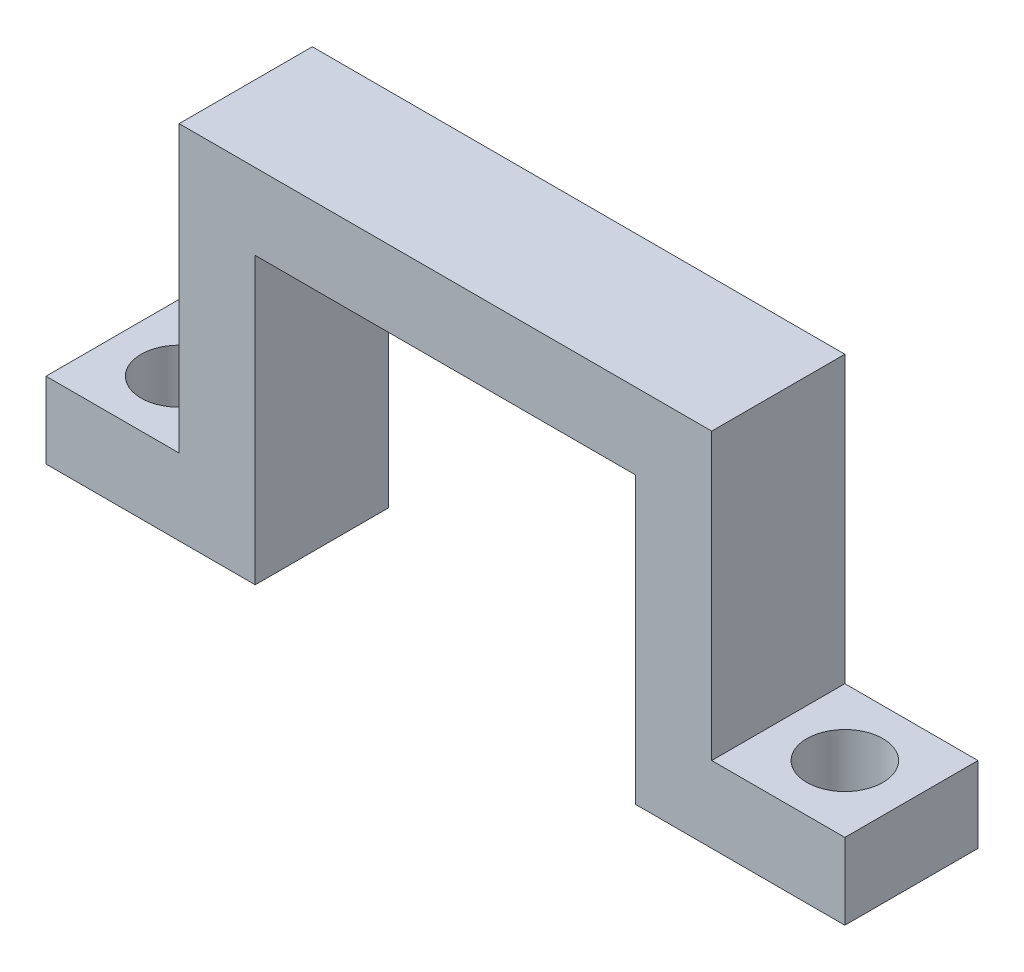
ISO-10303-21;
HEADER;
FILE_DESCRIPTION(('STEP AP214'),'2;1');
FILE_NAME('part.step','',(''),(''),'','','');
FILE_SCHEMA(('AUTOMOTIVE_DESIGN { 1 0 10303 214 1 1 1 1 }'));
ENDSEC;
DATA;
#1=APPLICATION_CONTEXT('core data for automotive mechanical design processes');
#2=APPLICATION_PROTOCOL_DEFINITION('international standard','automotive_design',2000,#1);
#3=PRODUCT_CONTEXT('',#1,'mechanical');
#4=PRODUCT('Part','Part','',(#3));
#5=PRODUCT_RELATED_PRODUCT_CATEGORY('part','',(#4));
#6=PRODUCT_DEFINITION_FORMATION('','',#4);
#7=PRODUCT_DEFINITION_CONTEXT('part definition',#1,'design');
#8=PRODUCT_DEFINITION('design','',#6,#7);
#9=PRODUCT_DEFINITION_SHAPE('','',#8);
#10=(LENGTH_UNIT() NAMED_UNIT(*) SI_UNIT(.MILLI.,.METRE.));
#11=(NAMED_UNIT(*) PLANE_ANGLE_UNIT() SI_UNIT($,.RADIAN.));
#12=(NAMED_UNIT(*) SI_UNIT($,.STERADIAN.) SOLID_ANGLE_UNIT());
#13=UNCERTAINTY_MEASURE_WITH_UNIT(LENGTH_MEASURE(1.E-05),#10,'distance_accuracy_value','');
#14=(GEOMETRIC_REPRESENTATION_CONTEXT(3) GLOBAL_UNCERTAINTY_ASSIGNED_CONTEXT((#13)) GLOBAL_UNIT_ASSIGNED_CONTEXT((#10,
#11,#12)) REPRESENTATION_CONTEXT('',''));
#15=CARTESIAN_POINT('',(0.,0.,0.));
#16=DIRECTION('',(0.,0.,1.));
#17=DIRECTION('',(1.,0.,0.));
#18=AXIS2_PLACEMENT_3D('',#15,#16,#17);
#19=CARTESIAN_POINT('',(-2.375,-4.,7.));
#20=DIRECTION('',(0.,1.,0.));
#21=DIRECTION('',(-1.,0.,0.));
#22=AXIS2_PLACEMENT_3D('',#19,#20,#21);
#23=PLANE('',#22);
#24=CARTESIAN_POINT('',(-9.87500000000001,-4.,3.5));
#25=DIRECTION('',(0.,1.,0.));
#26=DIRECTION('',(1.,0.,0.));
#27=AXIS2_PLACEMENT_3D('',#24,#25,#26);
#28=CIRCLE('',#27,2.);
#29=CARTESIAN_POINT('',(-7.87500000000001,-4.,3.5));
#30=VERTEX_POINT('',#29);
#31=EDGE_CURVE('E301',#30,#30,#28,.T.);
#32=ORIENTED_EDGE('',*,*,#31,.T.);
#33=EDGE_LOOP('',(#32));
#34=FACE_BOUND('',#33,.T.);
#35=DIRECTION('',(1.,0.,0.));
#36=VECTOR('',#35,1.);
#37=CARTESIAN_POINT('',(-2.375,-4.,0.));
#38=LINE('',#37,#36);
#39=CARTESIAN_POINT('',(-13.375,-4.,0.));
#40=VERTEX_POINT('',#39);
#41=CARTESIAN_POINT('',(-2.375,-4.,0.));
#42=VERTEX_POINT('',#41);
#43=EDGE_CURVE('E164',#40,#42,#38,.T.);
#44=ORIENTED_EDGE('',*,*,#43,.T.);
#45=DIRECTION('',(0.,0.,-1.));
#46=VECTOR('',#45,1.);
#47=CARTESIAN_POINT('',(-2.375,-4.,7.));
#48=LINE('',#47,#46);
#49=CARTESIAN_POINT('',(-2.375,-4.,7.));
#50=VERTEX_POINT('',#49);
#51=EDGE_CURVE('E11',#50,#42,#48,.T.);
#52=ORIENTED_EDGE('',*,*,#51,.F.);
#53=DIRECTION('',(1.,0.,0.));
#54=VECTOR('',#53,1.);
#55=CARTESIAN_POINT('',(-2.375,-4.,7.));
#56=LINE('',#55,#54);
#57=CARTESIAN_POINT('',(-13.375,-4.,7.));
#58=VERTEX_POINT('',#57);
#59=EDGE_CURVE('E199',#58,#50,#56,.T.);
#60=ORIENTED_EDGE('',*,*,#59,.F.);
#61=DIRECTION('',(0.,0.,-1.));
#62=VECTOR('',#61,1.);
#63=CARTESIAN_POINT('',(-13.375,-4.,7.));
#64=LINE('',#63,#62);
#65=EDGE_CURVE('E160',#58,#40,#64,.T.);
#66=ORIENTED_EDGE('',*,*,#65,.T.);
#67=EDGE_LOOP('',(#44,#52,#60,#66));
#68=FACE_BOUND('',#67,.T.);
#69=ADVANCED_FACE('F39',(#34,#68),#23,.F.);
#70=CARTESIAN_POINT('',(-2.375,-4.,7.));
#71=DIRECTION('',(-1.,0.,0.));
#72=DIRECTION('',(0.,0.,1.));
#73=AXIS2_PLACEMENT_3D('',#70,#71,#72);
#74=PLANE('',#73);
#75=DIRECTION('',(0.,1.,0.));
#76=VECTOR('',#75,1.);
#77=CARTESIAN_POINT('',(-2.375,-4.,0.));
#78=LINE('',#77,#76);
#79=CARTESIAN_POINT('',(-2.375,11.,0.));
#80=VERTEX_POINT('',#79);
#81=EDGE_CURVE('E168',#42,#80,#78,.T.);
#82=ORIENTED_EDGE('',*,*,#81,.T.);
#83=DIRECTION('',(0.,0.,-1.));
#84=VECTOR('',#83,1.);
#85=CARTESIAN_POINT('',(-2.375,11.,7.));
#86=LINE('',#85,#84);
#87=CARTESIAN_POINT('',(-2.375,11.,7.));
#88=VERTEX_POINT('',#87);
#89=EDGE_CURVE('E48',#88,#80,#86,.T.);
#90=ORIENTED_EDGE('',*,*,#89,.F.);
#91=DIRECTION('',(0.,1.,0.));
#92=VECTOR('',#91,1.);
#93=CARTESIAN_POINT('',(-2.375,-4.,7.));
#94=LINE('',#93,#92);
#95=EDGE_CURVE('E111',#50,#88,#94,.T.);
#96=ORIENTED_EDGE('',*,*,#95,.F.);
#97=ORIENTED_EDGE('',*,*,#51,.T.);
#98=EDGE_LOOP('',(#82,#90,#96,#97));
#99=FACE_BOUND('',#98,.T.);
#100=ADVANCED_FACE('F294',(#99),#74,.F.);
#101=CARTESIAN_POINT('',(-2.375,11.,7.));
#102=DIRECTION('',(0.,1.,0.));
#103=DIRECTION('',(-1.,0.,0.));
#104=AXIS2_PLACEMENT_3D('',#101,#102,#103);
#105=PLANE('',#104);
#106=DIRECTION('',(1.,0.,0.));
#107=VECTOR('',#106,1.);
#108=CARTESIAN_POINT('',(-2.375,11.,0.));
#109=LINE('',#108,#107);
#110=CARTESIAN_POINT('',(17.625,11.,0.));
#111=VERTEX_POINT('',#110);
#112=EDGE_CURVE('E172',#80,#111,#109,.T.);
#113=ORIENTED_EDGE('',*,*,#112,.T.);
#114=DIRECTION('',(0.,0.,-1.));
#115=VECTOR('',#114,1.);
#116=CARTESIAN_POINT('',(17.625,11.,7.));
#117=LINE('',#116,#115);
#118=CARTESIAN_POINT('',(17.625,11.,7.));
#119=VERTEX_POINT('',#118);
#120=EDGE_CURVE('E226',#119,#111,#117,.T.);
#121=ORIENTED_EDGE('',*,*,#120,.F.);
#122=DIRECTION('',(1.,0.,0.));
#123=VECTOR('',#122,1.);
#124=CARTESIAN_POINT('',(-2.375,11.,7.));
#125=LINE('',#124,#123);
#126=EDGE_CURVE('E236',#88,#119,#125,.T.);
#127=ORIENTED_EDGE('',*,*,#126,.F.);
#128=ORIENTED_EDGE('',*,*,#89,.T.);
#129=EDGE_LOOP('',(#113,#121,#127,#128));
#130=FACE_BOUND('',#129,.T.);
#131=ADVANCED_FACE('F234',(#130),#105,.F.);
#132=CARTESIAN_POINT('',(17.625,-4.,7.));
#133=DIRECTION('',(1.,0.,0.));
#134=DIRECTION('',(0.,1.,0.));
#135=AXIS2_PLACEMENT_3D('',#132,#133,#134);
#136=PLANE('',#135);
#137=DIRECTION('',(0.,-1.,0.));
#138=VECTOR('',#137,1.);
#139=CARTESIAN_POINT('',(17.625,-4.,0.));
#140=LINE('',#139,#138);
#141=CARTESIAN_POINT('',(17.625,-4.,0.));
#142=VERTEX_POINT('',#141);
#143=EDGE_CURVE('E175',#111,#142,#140,.T.);
#144=ORIENTED_EDGE('',*,*,#143,.T.);
#145=DIRECTION('',(0.,0.,-1.));
#146=VECTOR('',#145,1.);
#147=CARTESIAN_POINT('',(17.625,-4.,7.));
#148=LINE('',#147,#146);
#149=CARTESIAN_POINT('',(17.625,-4.,7.));
#150=VERTEX_POINT('',#149);
#151=EDGE_CURVE('E222',#150,#142,#148,.T.);
#152=ORIENTED_EDGE('',*,*,#151,.F.);
#153=DIRECTION('',(0.,-1.,0.));
#154=VECTOR('',#153,1.);
#155=CARTESIAN_POINT('',(17.625,-4.,7.));
#156=LINE('',#155,#154);
#157=EDGE_CURVE('E255',#119,#150,#156,.T.);
#158=ORIENTED_EDGE('',*,*,#157,.F.);
#159=ORIENTED_EDGE('',*,*,#120,.T.);
#160=EDGE_LOOP('',(#144,#152,#158,#159));
#161=FACE_BOUND('',#160,.T.);
#162=ADVANCED_FACE('F245',(#161),#136,.F.);
#163=CARTESIAN_POINT('',(17.625,-4.,7.));
#164=DIRECTION('',(0.,1.,0.));
#165=DIRECTION('',(-1.,0.,0.));
#166=AXIS2_PLACEMENT_3D('',#163,#164,#165);
#167=PLANE('',#166);
#168=CARTESIAN_POINT('',(25.125,-4.00000000000001,3.5));
#169=DIRECTION('',(0.,1.,0.));
#170=DIRECTION('',(-1.,0.,0.));
#171=AXIS2_PLACEMENT_3D('',#168,#169,#170);
#172=CIRCLE('',#171,2.);
#173=CARTESIAN_POINT('',(23.125,-4.00000000000001,3.5));
#174=VERTEX_POINT('',#173);
#175=EDGE_CURVE('E169',#174,#174,#172,.T.);
#176=ORIENTED_EDGE('',*,*,#175,.T.);
#177=EDGE_LOOP('',(#176));
#178=FACE_BOUND('',#177,.T.);
#179=DIRECTION('',(1.,0.,0.));
#180=VECTOR('',#179,1.);
#181=CARTESIAN_POINT('',(17.625,-4.,0.));
#182=LINE('',#181,#180);
#183=CARTESIAN_POINT('',(28.625,-4.,0.));
#184=VERTEX_POINT('',#183);
#185=EDGE_CURVE('E178',#142,#184,#182,.T.);
#186=ORIENTED_EDGE('',*,*,#185,.T.);
#187=DIRECTION('',(0.,0.,-1.));
#188=VECTOR('',#187,1.);
#189=CARTESIAN_POINT('',(28.625,-4.,7.));
#190=LINE('',#189,#188);
#191=CARTESIAN_POINT('',(28.625,-4.,7.));
#192=VERTEX_POINT('',#191);
#193=EDGE_CURVE('E218',#192,#184,#190,.T.);
#194=ORIENTED_EDGE('',*,*,#193,.F.);
#195=DIRECTION('',(1.,0.,0.));
#196=VECTOR('',#195,1.);
#197=CARTESIAN_POINT('',(17.625,-4.,7.));
#198=LINE('',#197,#196);
#199=EDGE_CURVE('E251',#150,#192,#198,.T.);
#200=ORIENTED_EDGE('',*,*,#199,.F.);
#201=ORIENTED_EDGE('',*,*,#151,.T.);
#202=EDGE_LOOP('',(#186,#194,#200,#201));
#203=FACE_BOUND('',#202,.T.);
#204=ADVANCED_FACE('F249',(#178,#203),#167,.F.);
#205=CARTESIAN_POINT('',(28.625,-4.,7.));
#206=DIRECTION('',(-1.,0.,0.));
#207=DIRECTION('',(0.,0.,1.));
#208=AXIS2_PLACEMENT_3D('',#205,#206,#207);
#209=PLANE('',#208);
#210=DIRECTION('',(0.,1.,0.));
#211=VECTOR('',#210,1.);
#212=CARTESIAN_POINT('',(28.625,-4.,0.));
#213=LINE('',#212,#211);
#214=CARTESIAN_POINT('',(28.625,0.,0.));
#215=VERTEX_POINT('',#214);
#216=EDGE_CURVE('E181',#184,#215,#213,.T.);
#217=ORIENTED_EDGE('',*,*,#216,.T.);
#218=DIRECTION('',(0.,0.,-1.));
#219=VECTOR('',#218,1.);
#220=CARTESIAN_POINT('',(28.625,0.,7.));
#221=LINE('',#220,#219);
#222=CARTESIAN_POINT('',(28.625,0.,7.));
#223=VERTEX_POINT('',#222);
#224=EDGE_CURVE('E214',#223,#215,#221,.T.);
#225=ORIENTED_EDGE('',*,*,#224,.F.);
#226=DIRECTION('',(0.,1.,0.));
#227=VECTOR('',#226,1.);
#228=CARTESIAN_POINT('',(28.625,-4.,7.));
#229=LINE('',#228,#227);
#230=EDGE_CURVE('E254',#192,#223,#229,.T.);
#231=ORIENTED_EDGE('',*,*,#230,.F.);
#232=ORIENTED_EDGE('',*,*,#193,.T.);
#233=EDGE_LOOP('',(#217,#225,#231,#232));
#234=FACE_BOUND('',#233,.T.);
#235=ADVANCED_FACE('F334',(#234),#209,.F.);
#236=CARTESIAN_POINT('',(28.625,0.,7.));
#237=DIRECTION('',(0.,-1.,0.));
#238=DIRECTION('',(1.,0.,0.));
#239=AXIS2_PLACEMENT_3D('',#236,#237,#238);
#240=PLANE('',#239);
#241=CARTESIAN_POINT('',(25.125,0.,3.5));
#242=DIRECTION('',(0.,1.,0.));
#243=DIRECTION('',(-1.,0.,0.));
#244=AXIS2_PLACEMENT_3D('',#241,#242,#243);
#245=CIRCLE('',#244,2.);
#246=CARTESIAN_POINT('',(23.125,0.,3.5));
#247=VERTEX_POINT('',#246);
#248=EDGE_CURVE('E304',#247,#247,#245,.T.);
#249=ORIENTED_EDGE('',*,*,#248,.F.);
#250=EDGE_LOOP('',(#249));
#251=FACE_BOUND('',#250,.T.);
#252=DIRECTION('',(-1.,0.,0.));
#253=VECTOR('',#252,1.);
#254=CARTESIAN_POINT('',(28.625,0.,0.));
#255=LINE('',#254,#253);
#256=CARTESIAN_POINT('',(21.625,0.,0.));
#257=VERTEX_POINT('',#256);
#258=EDGE_CURVE('E184',#215,#257,#255,.T.);
#259=ORIENTED_EDGE('',*,*,#258,.T.);
#260=DIRECTION('',(0.,0.,-1.));
#261=VECTOR('',#260,1.);
#262=CARTESIAN_POINT('',(21.625,0.,7.));
#263=LINE('',#262,#261);
#264=CARTESIAN_POINT('',(21.625,0.,7.));
#265=VERTEX_POINT('',#264);
#266=EDGE_CURVE('E210',#265,#257,#263,.T.);
#267=ORIENTED_EDGE('',*,*,#266,.F.);
#268=DIRECTION('',(-1.,0.,0.));
#269=VECTOR('',#268,1.);
#270=CARTESIAN_POINT('',(28.625,0.,7.));
#271=LINE('',#270,#269);
#272=EDGE_CURVE('E259',#223,#265,#271,.T.);
#273=ORIENTED_EDGE('',*,*,#272,.F.);
#274=ORIENTED_EDGE('',*,*,#224,.T.);
#275=EDGE_LOOP('',(#259,#267,#273,#274));
#276=FACE_BOUND('',#275,.T.);
#277=ADVANCED_FACE('F331',(#251,#276),#240,.F.);
#278=CARTESIAN_POINT('',(21.625,0.,7.));
#279=DIRECTION('',(-1.,0.,0.));
#280=DIRECTION('',(0.,-1.,0.));
#281=AXIS2_PLACEMENT_3D('',#278,#279,#280);
#282=PLANE('',#281);
#283=DIRECTION('',(0.,1.,0.));
#284=VECTOR('',#283,1.);
#285=CARTESIAN_POINT('',(21.625,0.,0.));
#286=LINE('',#285,#284);
#287=CARTESIAN_POINT('',(21.625,15.,0.));
#288=VERTEX_POINT('',#287);
#289=EDGE_CURVE('E187',#257,#288,#286,.T.);
#290=ORIENTED_EDGE('',*,*,#289,.T.);
#291=DIRECTION('',(0.,0.,-1.));
#292=VECTOR('',#291,1.);
#293=CARTESIAN_POINT('',(21.625,15.,7.));
#294=LINE('',#293,#292);
#295=CARTESIAN_POINT('',(21.625,15.,7.));
#296=VERTEX_POINT('',#295);
#297=EDGE_CURVE('E206',#296,#288,#294,.T.);
#298=ORIENTED_EDGE('',*,*,#297,.F.);
#299=DIRECTION('',(0.,1.,0.));
#300=VECTOR('',#299,1.);
#301=CARTESIAN_POINT('',(21.625,0.,7.));
#302=LINE('',#301,#300);
#303=EDGE_CURVE('E266',#265,#296,#302,.T.);
#304=ORIENTED_EDGE('',*,*,#303,.F.);
#305=ORIENTED_EDGE('',*,*,#266,.T.);
#306=EDGE_LOOP('',(#290,#298,#304,#305));
#307=FACE_BOUND('',#306,.T.);
#308=ADVANCED_FACE('F274',(#307),#282,.F.);
#309=CARTESIAN_POINT('',(-6.375,15.,7.));
#310=DIRECTION('',(0.,-1.,0.));
#311=DIRECTION('',(1.,0.,0.));
#312=AXIS2_PLACEMENT_3D('',#309,#310,#311);
#313=PLANE('',#312);
#314=DIRECTION('',(-1.,0.,0.));
#315=VECTOR('',#314,1.);
#316=CARTESIAN_POINT('',(-6.375,15.,0.));
#317=LINE('',#316,#315);
#318=CARTESIAN_POINT('',(-6.375,15.,0.));
#319=VERTEX_POINT('',#318);
#320=EDGE_CURVE('E190',#288,#319,#317,.T.);
#321=ORIENTED_EDGE('',*,*,#320,.T.);
#322=DIRECTION('',(0.,0.,-1.));
#323=VECTOR('',#322,1.);
#324=CARTESIAN_POINT('',(-6.375,15.,7.));
#325=LINE('',#324,#323);
#326=CARTESIAN_POINT('',(-6.375,15.,7.));
#327=VERTEX_POINT('',#326);
#328=EDGE_CURVE('E153',#327,#319,#325,.T.);
#329=ORIENTED_EDGE('',*,*,#328,.F.);
#330=DIRECTION('',(-1.,0.,0.));
#331=VECTOR('',#330,1.);
#332=CARTESIAN_POINT('',(-6.375,15.,7.));
#333=LINE('',#332,#331);
#334=EDGE_CURVE('E142',#296,#327,#333,.T.);
#335=ORIENTED_EDGE('',*,*,#334,.F.);
#336=ORIENTED_EDGE('',*,*,#297,.T.);
#337=EDGE_LOOP('',(#321,#329,#335,#336));
#338=FACE_BOUND('',#337,.T.);
#339=ADVANCED_FACE('F278',(#338),#313,.F.);
#340=CARTESIAN_POINT('',(-6.375,0.,7.));
#341=DIRECTION('',(1.,0.,0.));
#342=DIRECTION('',(0.,0.,-1.));
#343=AXIS2_PLACEMENT_3D('',#340,#341,#342);
#344=PLANE('',#343);
#345=DIRECTION('',(0.,-1.,0.));
#346=VECTOR('',#345,1.);
#347=CARTESIAN_POINT('',(-6.375,0.,0.));
#348=LINE('',#347,#346);
#349=CARTESIAN_POINT('',(-6.375,0.,0.));
#350=VERTEX_POINT('',#349);
#351=EDGE_CURVE('E151',#319,#350,#348,.T.);
#352=ORIENTED_EDGE('',*,*,#351,.T.);
#353=DIRECTION('',(0.,0.,-1.));
#354=VECTOR('',#353,1.);
#355=CARTESIAN_POINT('',(-6.375,0.,7.));
#356=LINE('',#355,#354);
#357=CARTESIAN_POINT('',(-6.375,0.,7.));
#358=VERTEX_POINT('',#357);
#359=EDGE_CURVE('E148',#358,#350,#356,.T.);
#360=ORIENTED_EDGE('',*,*,#359,.F.);
#361=DIRECTION('',(0.,-1.,0.));
#362=VECTOR('',#361,1.);
#363=CARTESIAN_POINT('',(-6.375,0.,7.));
#364=LINE('',#363,#362);
#365=EDGE_CURVE('E136',#327,#358,#364,.T.);
#366=ORIENTED_EDGE('',*,*,#365,.F.);
#367=ORIENTED_EDGE('',*,*,#328,.T.);
#368=EDGE_LOOP('',(#352,#360,#366,#367));
#369=FACE_BOUND('',#368,.T.);
#370=ADVANCED_FACE('F149',(#369),#344,.F.);
#371=CARTESIAN_POINT('',(-13.375,0.,7.));
#372=DIRECTION('',(0.,-1.,0.));
#373=DIRECTION('',(1.,0.,0.));
#374=AXIS2_PLACEMENT_3D('',#371,#372,#373);
#375=PLANE('',#374);
#376=CARTESIAN_POINT('',(-9.87500000000001,0.,3.5));
#377=DIRECTION('',(0.,1.,0.));
#378=DIRECTION('',(1.,0.,0.));
#379=AXIS2_PLACEMENT_3D('',#376,#377,#378);
#380=CIRCLE('',#379,2.);
#381=CARTESIAN_POINT('',(-7.87500000000001,0.,3.5));
#382=VERTEX_POINT('',#381);
#383=EDGE_CURVE('E305',#382,#382,#380,.T.);
#384=ORIENTED_EDGE('',*,*,#383,.F.);
#385=EDGE_LOOP('',(#384));
#386=FACE_BOUND('',#385,.T.);
#387=DIRECTION('',(-1.,0.,0.));
#388=VECTOR('',#387,1.);
#389=CARTESIAN_POINT('',(-13.375,0.,0.));
#390=LINE('',#389,#388);
#391=CARTESIAN_POINT('',(-13.375,0.,0.));
#392=VERTEX_POINT('',#391);
#393=EDGE_CURVE('E97',#350,#392,#390,.T.);
#394=ORIENTED_EDGE('',*,*,#393,.T.);
#395=DIRECTION('',(0.,0.,-1.));
#396=VECTOR('',#395,1.);
#397=CARTESIAN_POINT('',(-13.375,0.,7.));
#398=LINE('',#397,#396);
#399=CARTESIAN_POINT('',(-13.375,0.,7.));
#400=VERTEX_POINT('',#399);
#401=EDGE_CURVE('E154',#400,#392,#398,.T.);
#402=ORIENTED_EDGE('',*,*,#401,.F.);
#403=DIRECTION('',(-1.,0.,0.));
#404=VECTOR('',#403,1.);
#405=CARTESIAN_POINT('',(-13.375,0.,7.));
#406=LINE('',#405,#404);
#407=EDGE_CURVE('E140',#358,#400,#406,.T.);
#408=ORIENTED_EDGE('',*,*,#407,.F.);
#409=ORIENTED_EDGE('',*,*,#359,.T.);
#410=EDGE_LOOP('',(#394,#402,#408,#409));
#411=FACE_BOUND('',#410,.T.);
#412=ADVANCED_FACE('F156',(#386,#411),#375,.F.);
#413=CARTESIAN_POINT('',(-13.375,-4.,7.));
#414=DIRECTION('',(1.,0.,0.));
#415=DIRECTION('',(0.,0.,-1.));
#416=AXIS2_PLACEMENT_3D('',#413,#414,#415);
#417=PLANE('',#416);
#418=DIRECTION('',(0.,-1.,0.));
#419=VECTOR('',#418,1.);
#420=CARTESIAN_POINT('',(-13.375,-4.,0.));
#421=LINE('',#420,#419);
#422=EDGE_CURVE('E103',#392,#40,#421,.T.);
#423=ORIENTED_EDGE('',*,*,#422,.T.);
#424=ORIENTED_EDGE('',*,*,#65,.F.);
#425=DIRECTION('',(0.,-1.,0.));
#426=VECTOR('',#425,1.);
#427=CARTESIAN_POINT('',(-13.375,-4.,7.));
#428=LINE('',#427,#426);
#429=EDGE_CURVE('E56',#400,#58,#428,.T.);
#430=ORIENTED_EDGE('',*,*,#429,.F.);
#431=ORIENTED_EDGE('',*,*,#401,.T.);
#432=EDGE_LOOP('',(#423,#424,#430,#431));
#433=FACE_BOUND('',#432,.T.);
#434=ADVANCED_FACE('F282',(#433),#417,.F.);
#435=CARTESIAN_POINT('',(0.,0.,7.));
#436=DIRECTION('',(0.,0.,-1.));
#437=DIRECTION('',(-1.,0.,0.));
#438=AXIS2_PLACEMENT_3D('',#435,#436,#437);
#439=PLANE('',#438);
#440=ORIENTED_EDGE('',*,*,#59,.T.);
#441=ORIENTED_EDGE('',*,*,#95,.T.);
#442=ORIENTED_EDGE('',*,*,#126,.T.);
#443=ORIENTED_EDGE('',*,*,#157,.T.);
#444=ORIENTED_EDGE('',*,*,#199,.T.);
#445=ORIENTED_EDGE('',*,*,#230,.T.);
#446=ORIENTED_EDGE('',*,*,#272,.T.);
#447=ORIENTED_EDGE('',*,*,#303,.T.);
#448=ORIENTED_EDGE('',*,*,#334,.T.);
#449=ORIENTED_EDGE('',*,*,#365,.T.);
#450=ORIENTED_EDGE('',*,*,#407,.T.);
#451=ORIENTED_EDGE('',*,*,#429,.T.);
#452=EDGE_LOOP('',(#440,#441,#442,#443,#444,#445,#446,#447,#448,#449,#450,#451));
#453=FACE_BOUND('',#452,.T.);
#454=ADVANCED_FACE('F138',(#453),#439,.F.);
#455=CARTESIAN_POINT('',(0.,0.,0.));
#456=DIRECTION('',(0.,0.,-1.));
#457=DIRECTION('',(-1.,0.,0.));
#458=AXIS2_PLACEMENT_3D('',#455,#456,#457);
#459=PLANE('',#458);
#460=ORIENTED_EDGE('',*,*,#43,.F.);
#461=ORIENTED_EDGE('',*,*,#422,.F.);
#462=ORIENTED_EDGE('',*,*,#393,.F.);
#463=ORIENTED_EDGE('',*,*,#351,.F.);
#464=ORIENTED_EDGE('',*,*,#320,.F.);
#465=ORIENTED_EDGE('',*,*,#289,.F.);
#466=ORIENTED_EDGE('',*,*,#258,.F.);
#467=ORIENTED_EDGE('',*,*,#216,.F.);
#468=ORIENTED_EDGE('',*,*,#185,.F.);
#469=ORIENTED_EDGE('',*,*,#143,.F.);
#470=ORIENTED_EDGE('',*,*,#112,.F.);
#471=ORIENTED_EDGE('',*,*,#81,.F.);
#472=EDGE_LOOP('',(#460,#461,#462,#463,#464,#465,#466,#467,#468,#469,#470,#471));
#473=FACE_BOUND('',#472,.T.);
#474=ADVANCED_FACE('F240',(#473),#459,.T.);
#475=CARTESIAN_POINT('',(-9.87500000000001,-4.,3.5));
#476=DIRECTION('',(0.,1.,0.));
#477=DIRECTION('',(-1.,0.,0.));
#478=AXIS2_PLACEMENT_3D('',#475,#476,#477);
#479=CYLINDRICAL_SURFACE('',#478,2.);
#480=ORIENTED_EDGE('',*,*,#31,.F.);
#481=EDGE_LOOP('',(#480));
#482=FACE_BOUND('',#481,.T.);
#483=ORIENTED_EDGE('',*,*,#383,.T.);
#484=EDGE_LOOP('',(#483));
#485=FACE_BOUND('',#484,.T.);
#486=ADVANCED_FACE('F327',(#482,#485),#479,.F.);
#487=CARTESIAN_POINT('',(25.125,-4.00000000000001,3.5));
#488=DIRECTION('',(0.,1.,0.));
#489=DIRECTION('',(-1.,0.,0.));
#490=AXIS2_PLACEMENT_3D('',#487,#488,#489);
#491=CYLINDRICAL_SURFACE('',#490,2.);
#492=ORIENTED_EDGE('',*,*,#175,.F.);
#493=EDGE_LOOP('',(#492));
#494=FACE_BOUND('',#493,.T.);
#495=ORIENTED_EDGE('',*,*,#248,.T.);
#496=EDGE_LOOP('',(#495));
#497=FACE_BOUND('',#496,.T.);
#498=ADVANCED_FACE('F324',(#494,#497),#491,.F.);
#499=CLOSED_SHELL('',(#69,#100,#131,#162,#204,#235,#277,#308,#339,#370,#412,#434,#454,#474,#486,#498));
#500=MANIFOLD_SOLID_BREP('B2',#499);
#501=ADVANCED_BREP_SHAPE_REPRESENTATION('',(#18,#500),#14);
#502=SHAPE_DEFINITION_REPRESENTATION(#9,#501);
ENDSEC;
END-ISO-10303-21;
